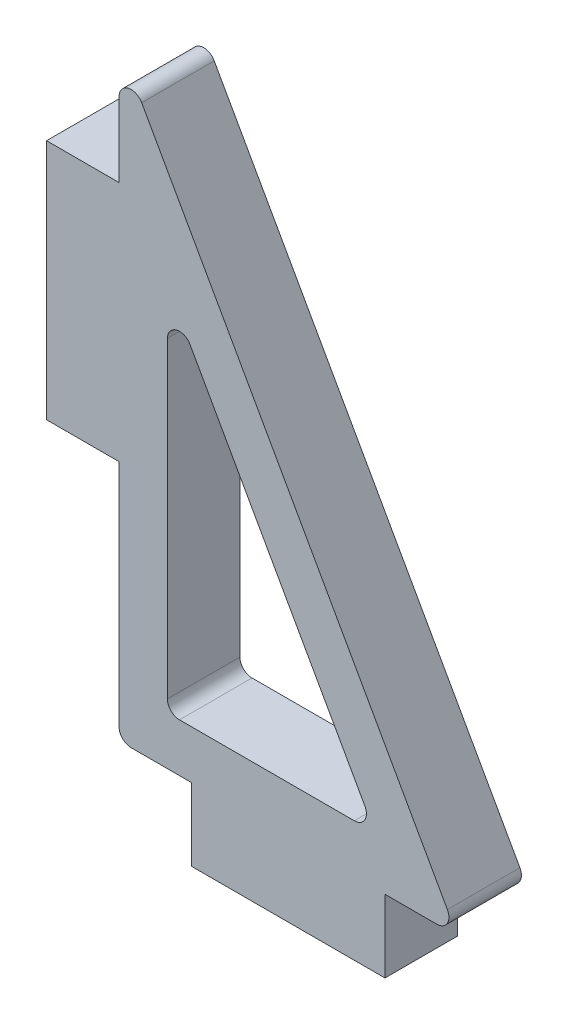
ISO-10303-21;
HEADER;
FILE_DESCRIPTION(('STEP AP214'),'2;1');
FILE_NAME('part.step','',(''),(''),'','','');
FILE_SCHEMA(('AUTOMOTIVE_DESIGN { 1 0 10303 214 1 1 1 1 }'));
ENDSEC;
DATA;
#1=APPLICATION_CONTEXT('core data for automotive mechanical design processes');
#2=APPLICATION_PROTOCOL_DEFINITION('international standard','automotive_design',2000,#1);
#3=PRODUCT_CONTEXT('',#1,'mechanical');
#4=PRODUCT('Part','Part','',(#3));
#5=PRODUCT_RELATED_PRODUCT_CATEGORY('part','',(#4));
#6=PRODUCT_DEFINITION_FORMATION('','',#4);
#7=PRODUCT_DEFINITION_CONTEXT('part definition',#1,'design');
#8=PRODUCT_DEFINITION('design','',#6,#7);
#9=PRODUCT_DEFINITION_SHAPE('','',#8);
#10=(LENGTH_UNIT() NAMED_UNIT(*) SI_UNIT(.MILLI.,.METRE.));
#11=(NAMED_UNIT(*) PLANE_ANGLE_UNIT() SI_UNIT($,.RADIAN.));
#12=(NAMED_UNIT(*) SI_UNIT($,.STERADIAN.) SOLID_ANGLE_UNIT());
#13=UNCERTAINTY_MEASURE_WITH_UNIT(LENGTH_MEASURE(1.E-05),#10,'distance_accuracy_value','');
#14=(GEOMETRIC_REPRESENTATION_CONTEXT(3) GLOBAL_UNCERTAINTY_ASSIGNED_CONTEXT((#13)) GLOBAL_UNIT_ASSIGNED_CONTEXT((#10,
#11,#12)) REPRESENTATION_CONTEXT('',''));
#15=CARTESIAN_POINT('',(0.,0.,0.));
#16=DIRECTION('',(0.,0.,1.));
#17=DIRECTION('',(1.,0.,0.));
#18=AXIS2_PLACEMENT_3D('',#15,#16,#17);
#19=CARTESIAN_POINT('',(3.,0.,3.));
#20=DIRECTION('',(1.,0.,0.));
#21=DIRECTION('',(0.,1.,0.));
#22=AXIS2_PLACEMENT_3D('',#19,#20,#21);
#23=PLANE('',#22);
#24=DIRECTION('',(0.,-1.,0.));
#25=VECTOR('',#24,1.);
#26=CARTESIAN_POINT('',(3.,0.,0.));
#27=LINE('',#26,#25);
#28=CARTESIAN_POINT('',(3.,0.,0.));
#29=VERTEX_POINT('',#28);
#30=CARTESIAN_POINT('',(3.,-3.,0.));
#31=VERTEX_POINT('',#30);
#32=EDGE_CURVE('E215',#29,#31,#27,.T.);
#33=ORIENTED_EDGE('',*,*,#32,.T.);
#34=DIRECTION('',(0.,0.,-1.));
#35=VECTOR('',#34,1.);
#36=CARTESIAN_POINT('',(3.,-3.,3.));
#37=LINE('',#36,#35);
#38=CARTESIAN_POINT('',(3.,-3.,3.));
#39=VERTEX_POINT('',#38);
#40=EDGE_CURVE('E11',#39,#31,#37,.T.);
#41=ORIENTED_EDGE('',*,*,#40,.F.);
#42=DIRECTION('',(0.,-1.,0.));
#43=VECTOR('',#42,1.);
#44=CARTESIAN_POINT('',(3.,0.,3.));
#45=LINE('',#44,#43);
#46=CARTESIAN_POINT('',(3.,0.,3.));
#47=VERTEX_POINT('',#46);
#48=EDGE_CURVE('E223',#47,#39,#45,.T.);
#49=ORIENTED_EDGE('',*,*,#48,.F.);
#50=DIRECTION('',(0.,0.,-1.));
#51=VECTOR('',#50,1.);
#52=CARTESIAN_POINT('',(3.,0.,3.));
#53=LINE('',#52,#51);
#54=EDGE_CURVE('E253',#47,#29,#53,.T.);
#55=ORIENTED_EDGE('',*,*,#54,.T.);
#56=EDGE_LOOP('',(#33,#41,#49,#55));
#57=FACE_BOUND('',#56,.T.);
#58=ADVANCED_FACE('F34',(#57),#23,.F.);
#59=CARTESIAN_POINT('',(3.,-3.,3.));
#60=DIRECTION('',(0.,1.,0.));
#61=DIRECTION('',(-1.,0.,0.));
#62=AXIS2_PLACEMENT_3D('',#59,#60,#61);
#63=PLANE('',#62);
#64=DIRECTION('',(1.,0.,0.));
#65=VECTOR('',#64,1.);
#66=CARTESIAN_POINT('',(3.,-3.,0.));
#67=LINE('',#66,#65);
#68=CARTESIAN_POINT('',(11.,-3.,0.));
#69=VERTEX_POINT('',#68);
#70=EDGE_CURVE('E256',#31,#69,#67,.T.);
#71=ORIENTED_EDGE('',*,*,#70,.T.);
#72=DIRECTION('',(0.,0.,-1.));
#73=VECTOR('',#72,1.);
#74=CARTESIAN_POINT('',(11.,-3.,3.));
#75=LINE('',#74,#73);
#76=CARTESIAN_POINT('',(11.,-3.,3.));
#77=VERTEX_POINT('',#76);
#78=EDGE_CURVE('E41',#77,#69,#75,.T.);
#79=ORIENTED_EDGE('',*,*,#78,.F.);
#80=DIRECTION('',(1.,0.,0.));
#81=VECTOR('',#80,1.);
#82=CARTESIAN_POINT('',(3.,-3.,3.));
#83=LINE('',#82,#81);
#84=EDGE_CURVE('E226',#39,#77,#83,.T.);
#85=ORIENTED_EDGE('',*,*,#84,.F.);
#86=ORIENTED_EDGE('',*,*,#40,.T.);
#87=EDGE_LOOP('',(#71,#79,#85,#86));
#88=FACE_BOUND('',#87,.T.);
#89=ADVANCED_FACE('F341',(#88),#63,.F.);
#90=CARTESIAN_POINT('',(11.,-3.,3.));
#91=DIRECTION('',(-1.,0.,0.));
#92=DIRECTION('',(0.,0.,1.));
#93=AXIS2_PLACEMENT_3D('',#90,#91,#92);
#94=PLANE('',#93);
#95=DIRECTION('',(0.,1.,0.));
#96=VECTOR('',#95,1.);
#97=CARTESIAN_POINT('',(11.,-3.,0.));
#98=LINE('',#97,#96);
#99=CARTESIAN_POINT('',(11.,0.,0.));
#100=VERTEX_POINT('',#99);
#101=EDGE_CURVE('E258',#69,#100,#98,.T.);
#102=ORIENTED_EDGE('',*,*,#101,.T.);
#103=DIRECTION('',(0.,0.,-1.));
#104=VECTOR('',#103,1.);
#105=CARTESIAN_POINT('',(11.,0.,3.));
#106=LINE('',#105,#104);
#107=CARTESIAN_POINT('',(11.,0.,3.));
#108=VERTEX_POINT('',#107);
#109=EDGE_CURVE('E313',#108,#100,#106,.T.);
#110=ORIENTED_EDGE('',*,*,#109,.F.);
#111=DIRECTION('',(0.,1.,0.));
#112=VECTOR('',#111,1.);
#113=CARTESIAN_POINT('',(11.,-3.,3.));
#114=LINE('',#113,#112);
#115=EDGE_CURVE('E229',#77,#108,#114,.T.);
#116=ORIENTED_EDGE('',*,*,#115,.F.);
#117=ORIENTED_EDGE('',*,*,#78,.T.);
#118=EDGE_LOOP('',(#102,#110,#116,#117));
#119=FACE_BOUND('',#118,.T.);
#120=ADVANCED_FACE('F320',(#119),#94,.F.);
#121=CARTESIAN_POINT('',(11.,0.,3.));
#122=DIRECTION('',(0.,1.,0.));
#123=DIRECTION('',(0.,0.,1.));
#124=AXIS2_PLACEMENT_3D('',#121,#122,#123);
#125=PLANE('',#124);
#126=DIRECTION('',(1.,0.,0.));
#127=VECTOR('',#126,1.);
#128=CARTESIAN_POINT('',(11.,0.,0.));
#129=LINE('',#128,#127);
#130=CARTESIAN_POINT('',(13.1469380487242,0.,0.));
#131=VERTEX_POINT('',#130);
#132=EDGE_CURVE('E260',#100,#131,#129,.T.);
#133=ORIENTED_EDGE('',*,*,#132,.T.);
#134=DIRECTION('',(0.,0.,-1.));
#135=VECTOR('',#134,1.);
#136=CARTESIAN_POINT('',(13.1469380487242,0.,3.));
#137=LINE('',#136,#135);
#138=CARTESIAN_POINT('',(13.1469380487242,0.,3.));
#139=VERTEX_POINT('',#138);
#140=EDGE_CURVE('E310',#139,#131,#137,.T.);
#141=ORIENTED_EDGE('',*,*,#140,.F.);
#142=DIRECTION('',(1.,0.,0.));
#143=VECTOR('',#142,1.);
#144=CARTESIAN_POINT('',(11.,0.,3.));
#145=LINE('',#144,#143);
#146=EDGE_CURVE('E231',#108,#139,#145,.T.);
#147=ORIENTED_EDGE('',*,*,#146,.F.);
#148=ORIENTED_EDGE('',*,*,#109,.T.);
#149=EDGE_LOOP('',(#133,#141,#147,#148));
#150=FACE_BOUND('',#149,.T.);
#151=ADVANCED_FACE('F329',(#150),#125,.F.);
#152=CARTESIAN_POINT('',(13.1469380487242,0.5,3.));
#153=DIRECTION('',(0.,0.,-1.));
#154=DIRECTION('',(-1.,0.,0.));
#155=AXIS2_PLACEMENT_3D('',#152,#153,#154);
#156=CYLINDRICAL_SURFACE('',#155,0.5);
#157=CARTESIAN_POINT('',(13.1469380487242,0.5,0.));
#158=DIRECTION('',(0.,0.,1.));
#159=DIRECTION('',(1.,0.,0.));
#160=AXIS2_PLACEMENT_3D('',#157,#158,#159);
#161=CIRCLE('',#160,0.5);
#162=CARTESIAN_POINT('',(13.5831910566991,0.744301684465927,0.));
#163=VERTEX_POINT('',#162);
#164=EDGE_CURVE('E262',#131,#163,#161,.T.);
#165=ORIENTED_EDGE('',*,*,#164,.T.);
#166=DIRECTION('',(0.,0.,-1.));
#167=VECTOR('',#166,1.);
#168=CARTESIAN_POINT('',(13.5831910566991,0.744301684465927,3.));
#169=LINE('',#168,#167);
#170=CARTESIAN_POINT('',(13.5831910566991,0.744301684465927,3.));
#171=VERTEX_POINT('',#170);
#172=EDGE_CURVE('E307',#171,#163,#169,.T.);
#173=ORIENTED_EDGE('',*,*,#172,.F.);
#174=CARTESIAN_POINT('',(13.1469380487242,0.5,3.));
#175=DIRECTION('',(0.,0.,1.));
#176=DIRECTION('',(1.,0.,0.));
#177=AXIS2_PLACEMENT_3D('',#174,#175,#176);
#178=CIRCLE('',#177,0.5);
#179=EDGE_CURVE('E233',#139,#171,#178,.T.);
#180=ORIENTED_EDGE('',*,*,#179,.F.);
#181=ORIENTED_EDGE('',*,*,#140,.T.);
#182=EDGE_LOOP('',(#165,#173,#180,#181));
#183=FACE_BOUND('',#182,.T.);
#184=ADVANCED_FACE('F333',(#183),#156,.T.);
#185=CARTESIAN_POINT('',(13.5831910566991,0.744301684465927,3.));
#186=DIRECTION('',(-0.87250601594972,-0.488603368931843,0.));
#187=DIRECTION('',(0.488603368931843,-0.87250601594972,0.));
#188=AXIS2_PLACEMENT_3D('',#185,#186,#187);
#189=PLANE('',#188);
#190=DIRECTION('',(-0.488603368931843,0.87250601594972,0.));
#191=VECTOR('',#190,1.);
#192=CARTESIAN_POINT('',(13.5831910566991,0.744301684465927,0.));
#193=LINE('',#192,#191);
#194=CARTESIAN_POINT('',(0.936253007974872,23.3281196286163,0.));
#195=VERTEX_POINT('',#194);
#196=EDGE_CURVE('E264',#163,#195,#193,.T.);
#197=ORIENTED_EDGE('',*,*,#196,.T.);
#198=DIRECTION('',(0.,0.,-1.));
#199=VECTOR('',#198,1.);
#200=CARTESIAN_POINT('',(0.936253007974872,23.3281196286163,3.));
#201=LINE('',#200,#199);
#202=CARTESIAN_POINT('',(0.936253007974872,23.3281196286163,3.));
#203=VERTEX_POINT('',#202);
#204=EDGE_CURVE('E304',#203,#195,#201,.T.);
#205=ORIENTED_EDGE('',*,*,#204,.F.);
#206=DIRECTION('',(-0.488603368931843,0.87250601594972,0.));
#207=VECTOR('',#206,1.);
#208=CARTESIAN_POINT('',(13.5831910566991,0.744301684465927,3.));
#209=LINE('',#208,#207);
#210=EDGE_CURVE('E235',#171,#203,#209,.T.);
#211=ORIENTED_EDGE('',*,*,#210,.F.);
#212=ORIENTED_EDGE('',*,*,#172,.T.);
#213=EDGE_LOOP('',(#197,#205,#211,#212));
#214=FACE_BOUND('',#213,.T.);
#215=ADVANCED_FACE('F384',(#214),#189,.F.);
#216=CARTESIAN_POINT('',(0.499999999999999,23.0838179441504,3.));
#217=DIRECTION('',(0.,0.,-1.));
#218=DIRECTION('',(-1.,0.,0.));
#219=AXIS2_PLACEMENT_3D('',#216,#217,#218);
#220=CYLINDRICAL_SURFACE('',#219,0.499999999999999);
#221=CARTESIAN_POINT('',(0.499999999999999,23.0838179441504,0.));
#222=DIRECTION('',(0.,0.,1.));
#223=DIRECTION('',(1.,0.,0.));
#224=AXIS2_PLACEMENT_3D('',#221,#222,#223);
#225=CIRCLE('',#224,0.499999999999999);
#226=CARTESIAN_POINT('',(0.,23.0838179441504,0.));
#227=VERTEX_POINT('',#226);
#228=EDGE_CURVE('E266',#195,#227,#225,.T.);
#229=ORIENTED_EDGE('',*,*,#228,.T.);
#230=DIRECTION('',(0.,0.,-1.));
#231=VECTOR('',#230,1.);
#232=CARTESIAN_POINT('',(0.,23.0838179441504,3.));
#233=LINE('',#232,#231);
#234=CARTESIAN_POINT('',(0.,23.0838179441504,3.));
#235=VERTEX_POINT('',#234);
#236=EDGE_CURVE('E301',#235,#227,#233,.T.);
#237=ORIENTED_EDGE('',*,*,#236,.F.);
#238=CARTESIAN_POINT('',(0.499999999999999,23.0838179441504,3.));
#239=DIRECTION('',(0.,0.,1.));
#240=DIRECTION('',(1.,0.,0.));
#241=AXIS2_PLACEMENT_3D('',#238,#239,#240);
#242=CIRCLE('',#241,0.499999999999999);
#243=EDGE_CURVE('E237',#203,#235,#242,.T.);
#244=ORIENTED_EDGE('',*,*,#243,.F.);
#245=ORIENTED_EDGE('',*,*,#204,.T.);
#246=EDGE_LOOP('',(#229,#237,#244,#245));
#247=FACE_BOUND('',#246,.T.);
#248=ADVANCED_FACE('F382',(#247),#220,.T.);
#249=CARTESIAN_POINT('',(0.,23.0838179441504,3.));
#250=DIRECTION('',(1.,0.,0.));
#251=DIRECTION('',(0.,1.,0.));
#252=AXIS2_PLACEMENT_3D('',#249,#250,#251);
#253=PLANE('',#252);
#254=DIRECTION('',(0.,-1.,0.));
#255=VECTOR('',#254,1.);
#256=CARTESIAN_POINT('',(0.,23.0838179441504,0.));
#257=LINE('',#256,#255);
#258=CARTESIAN_POINT('',(0.,20.,0.));
#259=VERTEX_POINT('',#258);
#260=EDGE_CURVE('E268',#227,#259,#257,.T.);
#261=ORIENTED_EDGE('',*,*,#260,.T.);
#262=DIRECTION('',(0.,0.,-1.));
#263=VECTOR('',#262,1.);
#264=CARTESIAN_POINT('',(0.,20.,3.));
#265=LINE('',#264,#263);
#266=CARTESIAN_POINT('',(0.,20.,3.));
#267=VERTEX_POINT('',#266);
#268=EDGE_CURVE('E298',#267,#259,#265,.T.);
#269=ORIENTED_EDGE('',*,*,#268,.F.);
#270=DIRECTION('',(0.,-1.,0.));
#271=VECTOR('',#270,1.);
#272=CARTESIAN_POINT('',(0.,23.0838179441504,3.));
#273=LINE('',#272,#271);
#274=EDGE_CURVE('E239',#235,#267,#273,.T.);
#275=ORIENTED_EDGE('',*,*,#274,.F.);
#276=ORIENTED_EDGE('',*,*,#236,.T.);
#277=EDGE_LOOP('',(#261,#269,#275,#276));
#278=FACE_BOUND('',#277,.T.);
#279=ADVANCED_FACE('F377',(#278),#253,.F.);
#280=CARTESIAN_POINT('',(0.,20.,3.));
#281=DIRECTION('',(0.,-1.,0.));
#282=DIRECTION('',(0.,0.,-1.));
#283=AXIS2_PLACEMENT_3D('',#280,#281,#282);
#284=PLANE('',#283);
#285=DIRECTION('',(-1.,0.,0.));
#286=VECTOR('',#285,1.);
#287=CARTESIAN_POINT('',(0.,20.,0.));
#288=LINE('',#287,#286);
#289=CARTESIAN_POINT('',(-3.,20.,0.));
#290=VERTEX_POINT('',#289);
#291=EDGE_CURVE('E270',#259,#290,#288,.T.);
#292=ORIENTED_EDGE('',*,*,#291,.T.);
#293=DIRECTION('',(0.,0.,-1.));
#294=VECTOR('',#293,1.);
#295=CARTESIAN_POINT('',(-3.,20.,3.));
#296=LINE('',#295,#294);
#297=CARTESIAN_POINT('',(-3.,20.,3.));
#298=VERTEX_POINT('',#297);
#299=EDGE_CURVE('E295',#298,#290,#296,.T.);
#300=ORIENTED_EDGE('',*,*,#299,.F.);
#301=DIRECTION('',(-1.,0.,0.));
#302=VECTOR('',#301,1.);
#303=CARTESIAN_POINT('',(0.,20.,3.));
#304=LINE('',#303,#302);
#305=EDGE_CURVE('E241',#267,#298,#304,.T.);
#306=ORIENTED_EDGE('',*,*,#305,.F.);
#307=ORIENTED_EDGE('',*,*,#268,.T.);
#308=EDGE_LOOP('',(#292,#300,#306,#307));
#309=FACE_BOUND('',#308,.T.);
#310=ADVANCED_FACE('F372',(#309),#284,.F.);
#311=CARTESIAN_POINT('',(-3.,20.,3.));
#312=DIRECTION('',(1.,0.,0.));
#313=DIRECTION('',(0.,1.,0.));
#314=AXIS2_PLACEMENT_3D('',#311,#312,#313);
#315=PLANE('',#314);
#316=DIRECTION('',(0.,-1.,0.));
#317=VECTOR('',#316,1.);
#318=CARTESIAN_POINT('',(-3.,20.,0.));
#319=LINE('',#318,#317);
#320=CARTESIAN_POINT('',(-3.,9.99999999999999,0.));
#321=VERTEX_POINT('',#320);
#322=EDGE_CURVE('E272',#290,#321,#319,.T.);
#323=ORIENTED_EDGE('',*,*,#322,.T.);
#324=DIRECTION('',(0.,0.,-1.));
#325=VECTOR('',#324,1.);
#326=CARTESIAN_POINT('',(-3.,9.99999999999999,3.));
#327=LINE('',#326,#325);
#328=CARTESIAN_POINT('',(-3.,9.99999999999999,3.));
#329=VERTEX_POINT('',#328);
#330=EDGE_CURVE('E292',#329,#321,#327,.T.);
#331=ORIENTED_EDGE('',*,*,#330,.F.);
#332=DIRECTION('',(0.,-1.,0.));
#333=VECTOR('',#332,1.);
#334=CARTESIAN_POINT('',(-3.,20.,3.));
#335=LINE('',#334,#333);
#336=EDGE_CURVE('E243',#298,#329,#335,.T.);
#337=ORIENTED_EDGE('',*,*,#336,.F.);
#338=ORIENTED_EDGE('',*,*,#299,.T.);
#339=EDGE_LOOP('',(#323,#331,#337,#338));
#340=FACE_BOUND('',#339,.T.);
#341=ADVANCED_FACE('F368',(#340),#315,.F.);
#342=CARTESIAN_POINT('',(-3.,9.99999999999999,3.));
#343=DIRECTION('',(0.,1.,0.));
#344=DIRECTION('',(0.,0.,1.));
#345=AXIS2_PLACEMENT_3D('',#342,#343,#344);
#346=PLANE('',#345);
#347=DIRECTION('',(1.,0.,0.));
#348=VECTOR('',#347,1.);
#349=CARTESIAN_POINT('',(-3.,9.99999999999999,0.));
#350=LINE('',#349,#348);
#351=CARTESIAN_POINT('',(0.,9.99999999999999,0.));
#352=VERTEX_POINT('',#351);
#353=EDGE_CURVE('E274',#321,#352,#350,.T.);
#354=ORIENTED_EDGE('',*,*,#353,.T.);
#355=DIRECTION('',(0.,0.,-1.));
#356=VECTOR('',#355,1.);
#357=CARTESIAN_POINT('',(0.,9.99999999999999,3.));
#358=LINE('',#357,#356);
#359=CARTESIAN_POINT('',(0.,9.99999999999999,3.));
#360=VERTEX_POINT('',#359);
#361=EDGE_CURVE('E289',#360,#352,#358,.T.);
#362=ORIENTED_EDGE('',*,*,#361,.F.);
#363=DIRECTION('',(1.,0.,0.));
#364=VECTOR('',#363,1.);
#365=CARTESIAN_POINT('',(-3.,9.99999999999999,3.));
#366=LINE('',#365,#364);
#367=EDGE_CURVE('E245',#329,#360,#366,.T.);
#368=ORIENTED_EDGE('',*,*,#367,.F.);
#369=ORIENTED_EDGE('',*,*,#330,.T.);
#370=EDGE_LOOP('',(#354,#362,#368,#369));
#371=FACE_BOUND('',#370,.T.);
#372=ADVANCED_FACE('F363',(#371),#346,.F.);
#373=CARTESIAN_POINT('',(0.,9.99999999999999,3.));
#374=DIRECTION('',(1.,0.,0.));
#375=DIRECTION('',(0.,0.,-1.));
#376=AXIS2_PLACEMENT_3D('',#373,#374,#375);
#377=PLANE('',#376);
#378=DIRECTION('',(0.,-1.,0.));
#379=VECTOR('',#378,1.);
#380=CARTESIAN_POINT('',(0.,9.99999999999999,0.));
#381=LINE('',#380,#379);
#382=CARTESIAN_POINT('',(0.,0.5,0.));
#383=VERTEX_POINT('',#382);
#384=EDGE_CURVE('E276',#352,#383,#381,.T.);
#385=ORIENTED_EDGE('',*,*,#384,.T.);
#386=DIRECTION('',(0.,0.,-1.));
#387=VECTOR('',#386,1.);
#388=CARTESIAN_POINT('',(0.,0.5,3.));
#389=LINE('',#388,#387);
#390=CARTESIAN_POINT('',(0.,0.5,3.));
#391=VERTEX_POINT('',#390);
#392=EDGE_CURVE('E286',#391,#383,#389,.T.);
#393=ORIENTED_EDGE('',*,*,#392,.F.);
#394=DIRECTION('',(0.,-1.,0.));
#395=VECTOR('',#394,1.);
#396=CARTESIAN_POINT('',(0.,9.99999999999999,3.));
#397=LINE('',#396,#395);
#398=EDGE_CURVE('E247',#360,#391,#397,.T.);
#399=ORIENTED_EDGE('',*,*,#398,.F.);
#400=ORIENTED_EDGE('',*,*,#361,.T.);
#401=EDGE_LOOP('',(#385,#393,#399,#400));
#402=FACE_BOUND('',#401,.T.);
#403=ADVANCED_FACE('F357',(#402),#377,.F.);
#404=CARTESIAN_POINT('',(0.5,0.5,3.));
#405=DIRECTION('',(0.,0.,-1.));
#406=DIRECTION('',(-1.,0.,0.));
#407=AXIS2_PLACEMENT_3D('',#404,#405,#406);
#408=CYLINDRICAL_SURFACE('',#407,0.5);
#409=CARTESIAN_POINT('',(0.5,0.5,0.));
#410=DIRECTION('',(0.,0.,1.));
#411=DIRECTION('',(-1.,0.,0.));
#412=AXIS2_PLACEMENT_3D('',#409,#410,#411);
#413=CIRCLE('',#412,0.5);
#414=CARTESIAN_POINT('',(0.500000000000004,0.,0.));
#415=VERTEX_POINT('',#414);
#416=EDGE_CURVE('E278',#383,#415,#413,.T.);
#417=ORIENTED_EDGE('',*,*,#416,.T.);
#418=DIRECTION('',(0.,0.,-1.));
#419=VECTOR('',#418,1.);
#420=CARTESIAN_POINT('',(0.500000000000004,0.,3.));
#421=LINE('',#420,#419);
#422=CARTESIAN_POINT('',(0.500000000000004,0.,3.));
#423=VERTEX_POINT('',#422);
#424=EDGE_CURVE('E283',#423,#415,#421,.T.);
#425=ORIENTED_EDGE('',*,*,#424,.F.);
#426=CARTESIAN_POINT('',(0.5,0.5,3.));
#427=DIRECTION('',(0.,0.,1.));
#428=DIRECTION('',(-1.,0.,0.));
#429=AXIS2_PLACEMENT_3D('',#426,#427,#428);
#430=CIRCLE('',#429,0.5);
#431=EDGE_CURVE('E249',#391,#423,#430,.T.);
#432=ORIENTED_EDGE('',*,*,#431,.F.);
#433=ORIENTED_EDGE('',*,*,#392,.T.);
#434=EDGE_LOOP('',(#417,#425,#432,#433));
#435=FACE_BOUND('',#434,.T.);
#436=ADVANCED_FACE('F353',(#435),#408,.T.);
#437=CARTESIAN_POINT('',(0.500000000000004,0.,3.));
#438=DIRECTION('',(0.,1.,0.));
#439=DIRECTION('',(0.,0.,1.));
#440=AXIS2_PLACEMENT_3D('',#437,#438,#439);
#441=PLANE('',#440);
#442=DIRECTION('',(1.,0.,0.));
#443=VECTOR('',#442,1.);
#444=CARTESIAN_POINT('',(0.500000000000004,0.,0.));
#445=LINE('',#444,#443);
#446=EDGE_CURVE('E227',#415,#29,#445,.T.);
#447=ORIENTED_EDGE('',*,*,#446,.T.);
#448=ORIENTED_EDGE('',*,*,#54,.F.);
#449=DIRECTION('',(1.,0.,0.));
#450=VECTOR('',#449,1.);
#451=CARTESIAN_POINT('',(0.500000000000004,0.,3.));
#452=LINE('',#451,#450);
#453=EDGE_CURVE('E251',#423,#47,#452,.T.);
#454=ORIENTED_EDGE('',*,*,#453,.F.);
#455=ORIENTED_EDGE('',*,*,#424,.T.);
#456=EDGE_LOOP('',(#447,#448,#454,#455));
#457=FACE_BOUND('',#456,.T.);
#458=ADVANCED_FACE('F348',(#457),#441,.F.);
#459=CARTESIAN_POINT('',(13.1469380487242,0.5,3.));
#460=DIRECTION('',(0.,0.,1.));
#461=DIRECTION('',(1.,0.,0.));
#462=AXIS2_PLACEMENT_3D('',#459,#460,#461);
#463=PLANE('',#462);
#464=CARTESIAN_POINT('',(9.73469024362112,2.5,3.));
#465=DIRECTION('',(0.,0.,1.));
#466=DIRECTION('',(1.,0.,0.));
#467=AXIS2_PLACEMENT_3D('',#464,#465,#466);
#468=CIRCLE('',#467,0.5);
#469=CARTESIAN_POINT('',(9.73469024362111,2.,3.));
#470=VERTEX_POINT('',#469);
#471=CARTESIAN_POINT('',(10.170943251596,2.74430168446593,3.));
#472=VERTEX_POINT('',#471);
#473=EDGE_CURVE('E48',#470,#472,#468,.T.);
#474=ORIENTED_EDGE('',*,*,#473,.F.);
#475=DIRECTION('',(1.,0.,0.));
#476=VECTOR('',#475,1.);
#477=CARTESIAN_POINT('',(2.50000000000001,2.,3.));
#478=LINE('',#477,#476);
#479=CARTESIAN_POINT('',(2.50000000000001,2.,3.));
#480=VERTEX_POINT('',#479);
#481=EDGE_CURVE('E189',#480,#470,#478,.T.);
#482=ORIENTED_EDGE('',*,*,#481,.F.);
#483=CARTESIAN_POINT('',(2.5,2.5,3.));
#484=DIRECTION('',(0.,0.,1.));
#485=DIRECTION('',(-1.,0.,0.));
#486=AXIS2_PLACEMENT_3D('',#483,#484,#485);
#487=CIRCLE('',#486,0.5);
#488=CARTESIAN_POINT('',(2.,2.5,3.));
#489=VERTEX_POINT('',#488);
#490=EDGE_CURVE('E192',#489,#480,#487,.T.);
#491=ORIENTED_EDGE('',*,*,#490,.F.);
#492=DIRECTION('',(0.,-1.,0.));
#493=VECTOR('',#492,1.);
#494=CARTESIAN_POINT('',(2.,15.419089720752,3.));
#495=LINE('',#494,#493);
#496=CARTESIAN_POINT('',(2.,15.419089720752,3.));
#497=VERTEX_POINT('',#496);
#498=EDGE_CURVE('E208',#497,#489,#495,.T.);
#499=ORIENTED_EDGE('',*,*,#498,.F.);
#500=CARTESIAN_POINT('',(2.5,15.419089720752,3.));
#501=DIRECTION('',(0.,0.,1.));
#502=DIRECTION('',(-1.,0.,0.));
#503=AXIS2_PLACEMENT_3D('',#500,#501,#502);
#504=CIRCLE('',#503,0.5);
#505=CARTESIAN_POINT('',(2.93625300797487,15.6633914052179,3.));
#506=VERTEX_POINT('',#505);
#507=EDGE_CURVE('E205',#506,#497,#504,.T.);
#508=ORIENTED_EDGE('',*,*,#507,.F.);
#509=DIRECTION('',(-0.488603368931843,0.87250601594972,0.));
#510=VECTOR('',#509,1.);
#511=CARTESIAN_POINT('',(10.170943251596,2.74430168446593,3.));
#512=LINE('',#511,#510);
#513=EDGE_CURVE('E203',#472,#506,#512,.T.);
#514=ORIENTED_EDGE('',*,*,#513,.F.);
#515=EDGE_LOOP('',(#474,#482,#491,#499,#508,#514));
#516=FACE_BOUND('',#515,.T.);
#517=ORIENTED_EDGE('',*,*,#48,.T.);
#518=ORIENTED_EDGE('',*,*,#84,.T.);
#519=ORIENTED_EDGE('',*,*,#115,.T.);
#520=ORIENTED_EDGE('',*,*,#146,.T.);
#521=ORIENTED_EDGE('',*,*,#179,.T.);
#522=ORIENTED_EDGE('',*,*,#210,.T.);
#523=ORIENTED_EDGE('',*,*,#243,.T.);
#524=ORIENTED_EDGE('',*,*,#274,.T.);
#525=ORIENTED_EDGE('',*,*,#305,.T.);
#526=ORIENTED_EDGE('',*,*,#336,.T.);
#527=ORIENTED_EDGE('',*,*,#367,.T.);
#528=ORIENTED_EDGE('',*,*,#398,.T.);
#529=ORIENTED_EDGE('',*,*,#431,.T.);
#530=ORIENTED_EDGE('',*,*,#453,.T.);
#531=EDGE_LOOP('',(#517,#518,#519,#520,#521,#522,#523,#524,#525,#526,#527,#528,#529,#530));
#532=FACE_BOUND('',#531,.T.);
#533=ADVANCED_FACE('F337',(#516,#532),#463,.T.);
#534=CARTESIAN_POINT('',(13.1469380487242,0.5,0.));
#535=DIRECTION('',(0.,0.,1.));
#536=DIRECTION('',(1.,0.,0.));
#537=AXIS2_PLACEMENT_3D('',#534,#535,#536);
#538=PLANE('',#537);
#539=DIRECTION('',(1.,0.,0.));
#540=VECTOR('',#539,1.);
#541=CARTESIAN_POINT('',(2.50000000000001,2.,0.));
#542=LINE('',#541,#540);
#543=CARTESIAN_POINT('',(2.50000000000001,2.,0.));
#544=VERTEX_POINT('',#543);
#545=CARTESIAN_POINT('',(9.73469024362111,2.,0.));
#546=VERTEX_POINT('',#545);
#547=EDGE_CURVE('E178',#544,#546,#542,.T.);
#548=ORIENTED_EDGE('',*,*,#547,.T.);
#549=CARTESIAN_POINT('',(9.73469024362112,2.5,0.));
#550=DIRECTION('',(0.,0.,1.));
#551=DIRECTION('',(1.,0.,0.));
#552=AXIS2_PLACEMENT_3D('',#549,#550,#551);
#553=CIRCLE('',#552,0.5);
#554=CARTESIAN_POINT('',(10.170943251596,2.74430168446593,0.));
#555=VERTEX_POINT('',#554);
#556=EDGE_CURVE('E172',#546,#555,#553,.T.);
#557=ORIENTED_EDGE('',*,*,#556,.T.);
#558=DIRECTION('',(-0.488603368931843,0.87250601594972,0.));
#559=VECTOR('',#558,1.);
#560=CARTESIAN_POINT('',(10.170943251596,2.74430168446593,0.));
#561=LINE('',#560,#559);
#562=CARTESIAN_POINT('',(2.93625300797487,15.6633914052179,0.));
#563=VERTEX_POINT('',#562);
#564=EDGE_CURVE('E181',#555,#563,#561,.T.);
#565=ORIENTED_EDGE('',*,*,#564,.T.);
#566=CARTESIAN_POINT('',(2.5,15.419089720752,0.));
#567=DIRECTION('',(0.,0.,1.));
#568=DIRECTION('',(-1.,0.,0.));
#569=AXIS2_PLACEMENT_3D('',#566,#567,#568);
#570=CIRCLE('',#569,0.5);
#571=CARTESIAN_POINT('',(2.,15.419089720752,0.));
#572=VERTEX_POINT('',#571);
#573=EDGE_CURVE('E56',#563,#572,#570,.T.);
#574=ORIENTED_EDGE('',*,*,#573,.T.);
#575=DIRECTION('',(0.,-1.,0.));
#576=VECTOR('',#575,1.);
#577=CARTESIAN_POINT('',(2.,15.419089720752,0.));
#578=LINE('',#577,#576);
#579=CARTESIAN_POINT('',(2.,2.5,0.));
#580=VERTEX_POINT('',#579);
#581=EDGE_CURVE('E196',#572,#580,#578,.T.);
#582=ORIENTED_EDGE('',*,*,#581,.T.);
#583=CARTESIAN_POINT('',(2.5,2.5,0.));
#584=DIRECTION('',(0.,0.,1.));
#585=DIRECTION('',(-1.,0.,0.));
#586=AXIS2_PLACEMENT_3D('',#583,#584,#585);
#587=CIRCLE('',#586,0.5);
#588=EDGE_CURVE('E199',#580,#544,#587,.T.);
#589=ORIENTED_EDGE('',*,*,#588,.T.);
#590=EDGE_LOOP('',(#548,#557,#565,#574,#582,#589));
#591=FACE_BOUND('',#590,.T.);
#592=ORIENTED_EDGE('',*,*,#32,.F.);
#593=ORIENTED_EDGE('',*,*,#446,.F.);
#594=ORIENTED_EDGE('',*,*,#416,.F.);
#595=ORIENTED_EDGE('',*,*,#384,.F.);
#596=ORIENTED_EDGE('',*,*,#353,.F.);
#597=ORIENTED_EDGE('',*,*,#322,.F.);
#598=ORIENTED_EDGE('',*,*,#291,.F.);
#599=ORIENTED_EDGE('',*,*,#260,.F.);
#600=ORIENTED_EDGE('',*,*,#228,.F.);
#601=ORIENTED_EDGE('',*,*,#196,.F.);
#602=ORIENTED_EDGE('',*,*,#164,.F.);
#603=ORIENTED_EDGE('',*,*,#132,.F.);
#604=ORIENTED_EDGE('',*,*,#101,.F.);
#605=ORIENTED_EDGE('',*,*,#70,.F.);
#606=EDGE_LOOP('',(#592,#593,#594,#595,#596,#597,#598,#599,#600,#601,#602,#603,#604,#605));
#607=FACE_BOUND('',#606,.T.);
#608=ADVANCED_FACE('F185',(#591,#607),#538,.F.);
#609=CARTESIAN_POINT('',(9.73469024362112,2.5,0.));
#610=DIRECTION('',(0.,0.,1.));
#611=DIRECTION('',(1.,0.,0.));
#612=AXIS2_PLACEMENT_3D('',#609,#610,#611);
#613=CYLINDRICAL_SURFACE('',#612,0.5);
#614=ORIENTED_EDGE('',*,*,#473,.T.);
#615=DIRECTION('',(0.,0.,1.));
#616=VECTOR('',#615,1.);
#617=CARTESIAN_POINT('',(10.170943251596,2.74430168446593,0.));
#618=LINE('',#617,#616);
#619=EDGE_CURVE('E168',#555,#472,#618,.T.);
#620=ORIENTED_EDGE('',*,*,#619,.F.);
#621=ORIENTED_EDGE('',*,*,#556,.F.);
#622=DIRECTION('',(0.,0.,1.));
#623=VECTOR('',#622,1.);
#624=CARTESIAN_POINT('',(9.73469024362111,2.,0.));
#625=LINE('',#624,#623);
#626=EDGE_CURVE('E213',#546,#470,#625,.T.);
#627=ORIENTED_EDGE('',*,*,#626,.T.);
#628=EDGE_LOOP('',(#614,#620,#621,#627));
#629=FACE_BOUND('',#628,.T.);
#630=ADVANCED_FACE('F170',(#629),#613,.F.);
#631=CARTESIAN_POINT('',(2.50000000000001,2.,0.));
#632=DIRECTION('',(0.,-1.,0.));
#633=DIRECTION('',(0.,0.,-1.));
#634=AXIS2_PLACEMENT_3D('',#631,#632,#633);
#635=PLANE('',#634);
#636=ORIENTED_EDGE('',*,*,#481,.T.);
#637=ORIENTED_EDGE('',*,*,#626,.F.);
#638=ORIENTED_EDGE('',*,*,#547,.F.);
#639=DIRECTION('',(0.,0.,1.));
#640=VECTOR('',#639,1.);
#641=CARTESIAN_POINT('',(2.50000000000001,2.,0.));
#642=LINE('',#641,#640);
#643=EDGE_CURVE('E216',#544,#480,#642,.T.);
#644=ORIENTED_EDGE('',*,*,#643,.T.);
#645=EDGE_LOOP('',(#636,#637,#638,#644));
#646=FACE_BOUND('',#645,.T.);
#647=ADVANCED_FACE('F503',(#646),#635,.F.);
#648=CARTESIAN_POINT('',(2.5,2.5,0.));
#649=DIRECTION('',(0.,0.,1.));
#650=DIRECTION('',(1.,0.,0.));
#651=AXIS2_PLACEMENT_3D('',#648,#649,#650);
#652=CYLINDRICAL_SURFACE('',#651,0.5);
#653=ORIENTED_EDGE('',*,*,#490,.T.);
#654=ORIENTED_EDGE('',*,*,#643,.F.);
#655=ORIENTED_EDGE('',*,*,#588,.F.);
#656=DIRECTION('',(0.,0.,1.));
#657=VECTOR('',#656,1.);
#658=CARTESIAN_POINT('',(2.,2.5,0.));
#659=LINE('',#658,#657);
#660=EDGE_CURVE('E218',#580,#489,#659,.T.);
#661=ORIENTED_EDGE('',*,*,#660,.T.);
#662=EDGE_LOOP('',(#653,#654,#655,#661));
#663=FACE_BOUND('',#662,.T.);
#664=ADVANCED_FACE('F512',(#663),#652,.F.);
#665=CARTESIAN_POINT('',(2.,15.419089720752,0.));
#666=DIRECTION('',(-1.,0.,0.));
#667=DIRECTION('',(0.,-1.,0.));
#668=AXIS2_PLACEMENT_3D('',#665,#666,#667);
#669=PLANE('',#668);
#670=ORIENTED_EDGE('',*,*,#498,.T.);
#671=ORIENTED_EDGE('',*,*,#660,.F.);
#672=ORIENTED_EDGE('',*,*,#581,.F.);
#673=DIRECTION('',(0.,0.,1.));
#674=VECTOR('',#673,1.);
#675=CARTESIAN_POINT('',(2.,15.419089720752,0.));
#676=LINE('',#675,#674);
#677=EDGE_CURVE('E220',#572,#497,#676,.T.);
#678=ORIENTED_EDGE('',*,*,#677,.T.);
#679=EDGE_LOOP('',(#670,#671,#672,#678));
#680=FACE_BOUND('',#679,.T.);
#681=ADVANCED_FACE('F522',(#680),#669,.F.);
#682=CARTESIAN_POINT('',(2.5,15.419089720752,0.));
#683=DIRECTION('',(0.,0.,1.));
#684=DIRECTION('',(1.,0.,0.));
#685=AXIS2_PLACEMENT_3D('',#682,#683,#684);
#686=CYLINDRICAL_SURFACE('',#685,0.5);
#687=ORIENTED_EDGE('',*,*,#507,.T.);
#688=ORIENTED_EDGE('',*,*,#677,.F.);
#689=ORIENTED_EDGE('',*,*,#573,.F.);
#690=DIRECTION('',(0.,0.,1.));
#691=VECTOR('',#690,1.);
#692=CARTESIAN_POINT('',(2.93625300797487,15.6633914052179,0.));
#693=LINE('',#692,#691);
#694=EDGE_CURVE('E177',#563,#506,#693,.T.);
#695=ORIENTED_EDGE('',*,*,#694,.T.);
#696=EDGE_LOOP('',(#687,#688,#689,#695));
#697=FACE_BOUND('',#696,.T.);
#698=ADVANCED_FACE('F532',(#697),#686,.F.);
#699=CARTESIAN_POINT('',(10.170943251596,2.74430168446593,0.));
#700=DIRECTION('',(0.87250601594972,0.488603368931843,0.));
#701=DIRECTION('',(-0.488603368931843,0.87250601594972,0.));
#702=AXIS2_PLACEMENT_3D('',#699,#700,#701);
#703=PLANE('',#702);
#704=ORIENTED_EDGE('',*,*,#513,.T.);
#705=ORIENTED_EDGE('',*,*,#694,.F.);
#706=ORIENTED_EDGE('',*,*,#564,.F.);
#707=ORIENTED_EDGE('',*,*,#619,.T.);
#708=EDGE_LOOP('',(#704,#705,#706,#707));
#709=FACE_BOUND('',#708,.T.);
#710=ADVANCED_FACE('F182',(#709),#703,.F.);
#711=CLOSED_SHELL('',(#58,#89,#120,#151,#184,#215,#248,#279,#310,#341,#372,#403,#436,#458,#533,
#608,#630,#647,#664,#681,#698,#710));
#712=MANIFOLD_SOLID_BREP('B2',#711);
#713=ADVANCED_BREP_SHAPE_REPRESENTATION('',(#18,#712),#14);
#714=SHAPE_DEFINITION_REPRESENTATION(#9,#713);
ENDSEC;
END-ISO-10303-21;
